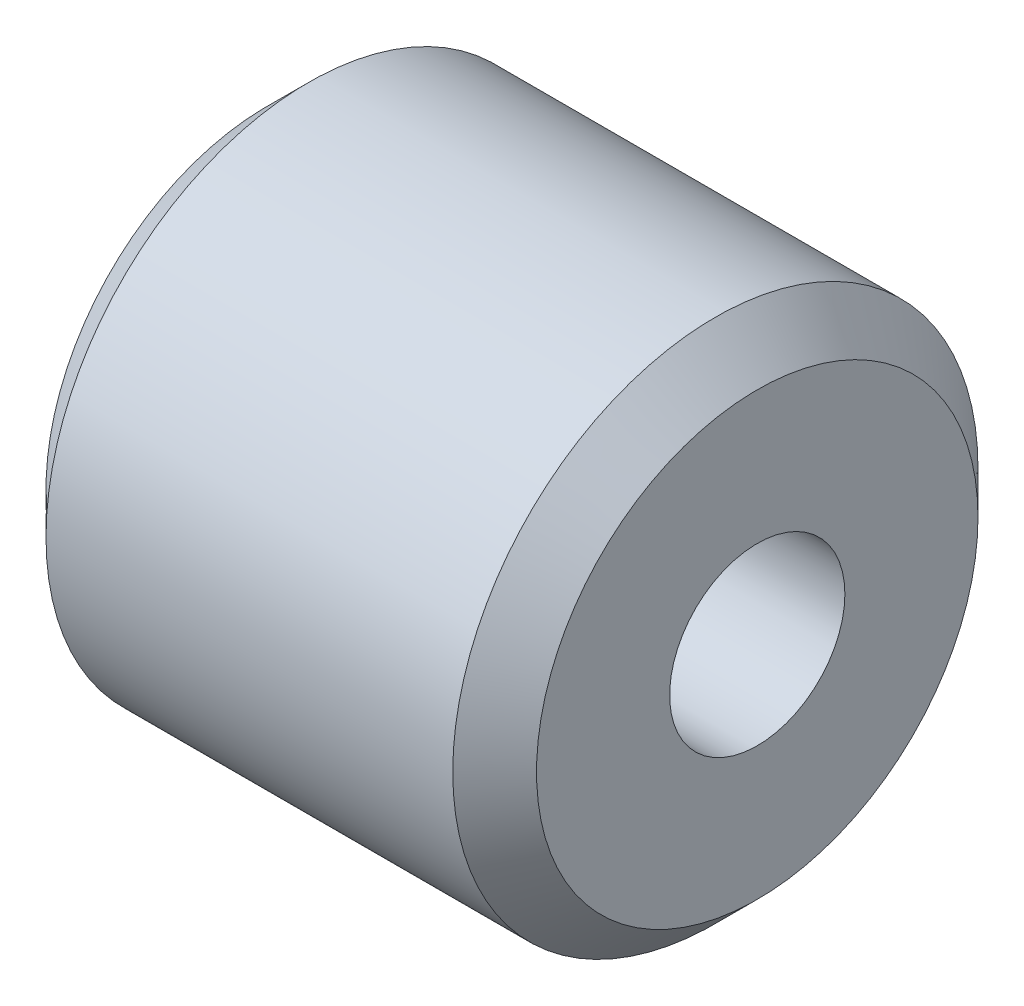
ISO-10303-21;
HEADER;
FILE_DESCRIPTION(('STEP AP214'),'2;1');
FILE_NAME('part.step','',(''),(''),'','','');
FILE_SCHEMA(('AUTOMOTIVE_DESIGN { 1 0 10303 214 1 1 1 1 }'));
ENDSEC;
DATA;
#1=APPLICATION_CONTEXT('core data for automotive mechanical design processes');
#2=APPLICATION_PROTOCOL_DEFINITION('international standard','automotive_design',2000,#1);
#3=PRODUCT_CONTEXT('',#1,'mechanical');
#4=PRODUCT('Part','Part','',(#3));
#5=PRODUCT_RELATED_PRODUCT_CATEGORY('part','',(#4));
#6=PRODUCT_DEFINITION_FORMATION('','',#4);
#7=PRODUCT_DEFINITION_CONTEXT('part definition',#1,'design');
#8=PRODUCT_DEFINITION('design','',#6,#7);
#9=PRODUCT_DEFINITION_SHAPE('','',#8);
#10=(LENGTH_UNIT() NAMED_UNIT(*) SI_UNIT(.MILLI.,.METRE.));
#11=(NAMED_UNIT(*) PLANE_ANGLE_UNIT() SI_UNIT($,.RADIAN.));
#12=(NAMED_UNIT(*) SI_UNIT($,.STERADIAN.) SOLID_ANGLE_UNIT());
#13=UNCERTAINTY_MEASURE_WITH_UNIT(LENGTH_MEASURE(1.E-05),#10,'distance_accuracy_value','');
#14=(GEOMETRIC_REPRESENTATION_CONTEXT(3) GLOBAL_UNCERTAINTY_ASSIGNED_CONTEXT((#13)) GLOBAL_UNIT_ASSIGNED_CONTEXT((#10,
#11,#12)) REPRESENTATION_CONTEXT('',''));
#15=CARTESIAN_POINT('',(0.,0.,0.));
#16=DIRECTION('',(0.,0.,1.));
#17=DIRECTION('',(1.,0.,0.));
#18=AXIS2_PLACEMENT_3D('',#15,#16,#17);
#19=CARTESIAN_POINT('',(4.45,0.,0.));
#20=DIRECTION('',(1.,0.,0.));
#21=DIRECTION('',(0.,0.,-1.));
#22=AXIS2_PLACEMENT_3D('',#19,#20,#21);
#23=PLANE('',#22);
#24=CARTESIAN_POINT('',(4.45,0.,0.));
#25=DIRECTION('',(1.,0.,0.));
#26=DIRECTION('',(0.,0.,-1.));
#27=AXIS2_PLACEMENT_3D('',#24,#25,#26);
#28=CIRCLE('',#27,4.005);
#29=CARTESIAN_POINT('',(4.45,0.,-4.005));
#30=VERTEX_POINT('',#29);
#31=EDGE_CURVE('E59',#30,#30,#28,.T.);
#32=ORIENTED_EDGE('',*,*,#31,.T.);
#33=EDGE_LOOP('',(#32));
#34=FACE_BOUND('',#33,.T.);
#35=CARTESIAN_POINT('',(4.45,0.,0.));
#36=DIRECTION('',(1.,0.,0.));
#37=DIRECTION('',(0.,0.,-1.));
#38=AXIS2_PLACEMENT_3D('',#35,#36,#37);
#39=CIRCLE('',#38,1.59);
#40=CARTESIAN_POINT('',(4.45,0.,-1.59));
#41=VERTEX_POINT('',#40);
#42=EDGE_CURVE('E64',#41,#41,#39,.T.);
#43=ORIENTED_EDGE('',*,*,#42,.F.);
#44=EDGE_LOOP('',(#43));
#45=FACE_BOUND('',#44,.T.);
#46=ADVANCED_FACE('F43',(#34,#45),#23,.T.);
#47=CARTESIAN_POINT('',(-4.45,0.,0.));
#48=DIRECTION('',(1.,0.,0.));
#49=DIRECTION('',(0.,0.,-1.));
#50=AXIS2_PLACEMENT_3D('',#47,#48,#49);
#51=PLANE('',#50);
#52=CARTESIAN_POINT('',(-4.45,0.,0.));
#53=DIRECTION('',(1.,0.,0.));
#54=DIRECTION('',(0.,0.,-1.));
#55=AXIS2_PLACEMENT_3D('',#52,#53,#54);
#56=CIRCLE('',#55,4.00499999999999);
#57=CARTESIAN_POINT('',(-4.45,0.,-4.00499999999999));
#58=VERTEX_POINT('',#57);
#59=EDGE_CURVE('E10',#58,#58,#56,.F.);
#60=ORIENTED_EDGE('',*,*,#59,.T.);
#61=EDGE_LOOP('',(#60));
#62=FACE_BOUND('',#61,.T.);
#63=CARTESIAN_POINT('',(-4.45,0.,0.));
#64=DIRECTION('',(1.,0.,0.));
#65=DIRECTION('',(0.,0.,-1.));
#66=AXIS2_PLACEMENT_3D('',#63,#64,#65);
#67=CIRCLE('',#66,1.59);
#68=CARTESIAN_POINT('',(-4.45,0.,-1.59));
#69=VERTEX_POINT('',#68);
#70=EDGE_CURVE('E65',#69,#69,#67,.T.);
#71=ORIENTED_EDGE('',*,*,#70,.T.);
#72=EDGE_LOOP('',(#71));
#73=FACE_BOUND('',#72,.T.);
#74=ADVANCED_FACE('F75',(#62,#73),#51,.F.);
#75=CARTESIAN_POINT('',(4.45,0.,0.));
#76=DIRECTION('',(-1.,0.,0.));
#77=DIRECTION('',(0.,0.,1.));
#78=AXIS2_PLACEMENT_3D('',#75,#76,#77);
#79=CYLINDRICAL_SURFACE('',#78,4.765);
#80=CARTESIAN_POINT('',(3.69,0.,0.));
#81=DIRECTION('',(1.,0.,0.));
#82=DIRECTION('',(0.,0.,-1.));
#83=AXIS2_PLACEMENT_3D('',#80,#81,#82);
#84=CIRCLE('',#83,4.765);
#85=CARTESIAN_POINT('',(3.69,0.,-4.765));
#86=VERTEX_POINT('',#85);
#87=EDGE_CURVE('E51',#86,#86,#84,.F.);
#88=ORIENTED_EDGE('',*,*,#87,.T.);
#89=EDGE_LOOP('',(#88));
#90=FACE_BOUND('',#89,.T.);
#91=CARTESIAN_POINT('',(-3.69,0.,0.));
#92=DIRECTION('',(1.,0.,0.));
#93=DIRECTION('',(0.,0.,-1.));
#94=AXIS2_PLACEMENT_3D('',#91,#92,#93);
#95=CIRCLE('',#94,4.765);
#96=CARTESIAN_POINT('',(-3.69,0.,-4.765));
#97=VERTEX_POINT('',#96);
#98=EDGE_CURVE('E55',#97,#97,#95,.T.);
#99=ORIENTED_EDGE('',*,*,#98,.T.);
#100=EDGE_LOOP('',(#99));
#101=FACE_BOUND('',#100,.T.);
#102=ADVANCED_FACE('F81',(#90,#101),#79,.T.);
#103=CARTESIAN_POINT('',(4.45,0.,0.));
#104=DIRECTION('',(-1.,0.,0.));
#105=DIRECTION('',(0.,0.,1.));
#106=AXIS2_PLACEMENT_3D('',#103,#104,#105);
#107=CYLINDRICAL_SURFACE('',#106,1.59);
#108=ORIENTED_EDGE('',*,*,#42,.T.);
#109=EDGE_LOOP('',(#108));
#110=FACE_BOUND('',#109,.T.);
#111=ORIENTED_EDGE('',*,*,#70,.F.);
#112=EDGE_LOOP('',(#111));
#113=FACE_BOUND('',#112,.T.);
#114=ADVANCED_FACE('F71',(#110,#113),#107,.F.);
#115=CARTESIAN_POINT('',(4.45,0.,0.));
#116=DIRECTION('',(-1.,0.,0.));
#117=DIRECTION('',(0.,0.,1.));
#118=AXIS2_PLACEMENT_3D('',#115,#116,#117);
#119=CONICAL_SURFACE('',#118,4.005,0.785398163397447);
#120=ORIENTED_EDGE('',*,*,#87,.F.);
#121=EDGE_LOOP('',(#120));
#122=FACE_BOUND('',#121,.T.);
#123=ORIENTED_EDGE('',*,*,#31,.F.);
#124=EDGE_LOOP('',(#123));
#125=FACE_BOUND('',#124,.T.);
#126=ADVANCED_FACE('F87',(#122,#125),#119,.T.);
#127=CARTESIAN_POINT('',(-3.69,0.,0.));
#128=DIRECTION('',(1.,0.,0.));
#129=DIRECTION('',(0.,0.,-1.));
#130=AXIS2_PLACEMENT_3D('',#127,#128,#129);
#131=CONICAL_SURFACE('',#130,4.765,0.78539816339745);
#132=ORIENTED_EDGE('',*,*,#59,.F.);
#133=EDGE_LOOP('',(#132));
#134=FACE_BOUND('',#133,.T.);
#135=ORIENTED_EDGE('',*,*,#98,.F.);
#136=EDGE_LOOP('',(#135));
#137=FACE_BOUND('',#136,.T.);
#138=ADVANCED_FACE('F46',(#134,#137),#131,.T.);
#139=CLOSED_SHELL('',(#46,#74,#102,#114,#126,#138));
#140=MANIFOLD_SOLID_BREP('B2',#139);
#141=ADVANCED_BREP_SHAPE_REPRESENTATION('',(#18,#140),#14);
#142=SHAPE_DEFINITION_REPRESENTATION(#9,#141);
ENDSEC;
END-ISO-10303-21;
